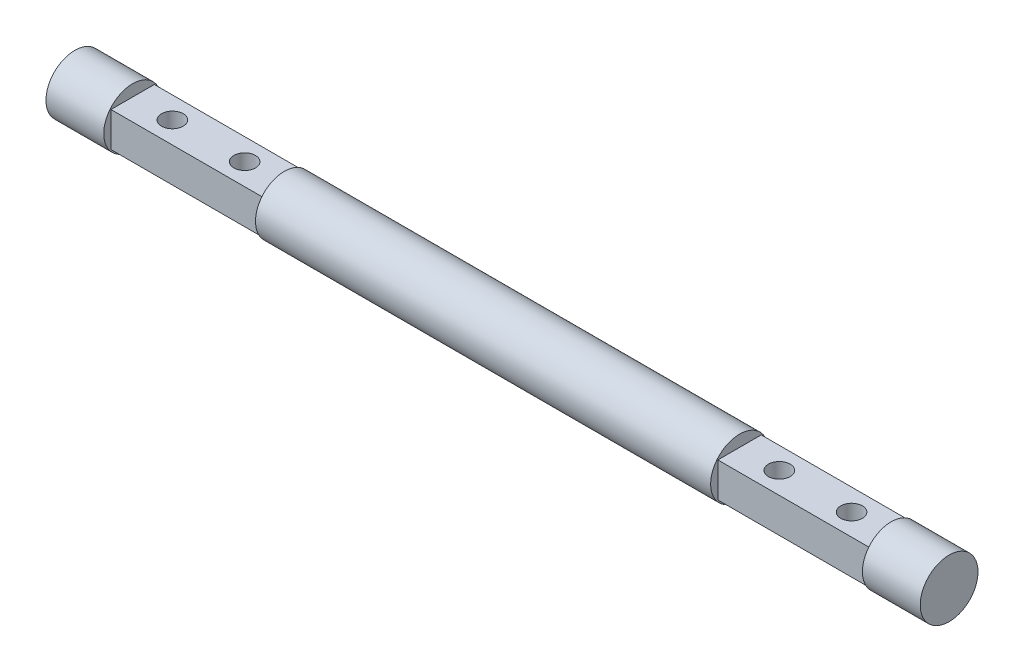
ISO-10303-21;
HEADER;
FILE_DESCRIPTION(('STEP AP214'),'2;1');
FILE_NAME('part.step','',(''),(''),'','','');
FILE_SCHEMA(('AUTOMOTIVE_DESIGN { 1 0 10303 214 1 1 1 1 }'));
ENDSEC;
DATA;
#1=APPLICATION_CONTEXT('core data for automotive mechanical design processes');
#2=APPLICATION_PROTOCOL_DEFINITION('international standard','automotive_design',2000,#1);
#3=PRODUCT_CONTEXT('',#1,'mechanical');
#4=PRODUCT('Part','Part','',(#3));
#5=PRODUCT_RELATED_PRODUCT_CATEGORY('part','',(#4));
#6=PRODUCT_DEFINITION_FORMATION('','',#4);
#7=PRODUCT_DEFINITION_CONTEXT('part definition',#1,'design');
#8=PRODUCT_DEFINITION('design','',#6,#7);
#9=PRODUCT_DEFINITION_SHAPE('','',#8);
#10=(LENGTH_UNIT() NAMED_UNIT(*) SI_UNIT(.MILLI.,.METRE.));
#11=(NAMED_UNIT(*) PLANE_ANGLE_UNIT() SI_UNIT($,.RADIAN.));
#12=(NAMED_UNIT(*) SI_UNIT($,.STERADIAN.) SOLID_ANGLE_UNIT());
#13=UNCERTAINTY_MEASURE_WITH_UNIT(LENGTH_MEASURE(1.E-05),#10,'distance_accuracy_value','');
#14=(GEOMETRIC_REPRESENTATION_CONTEXT(3) GLOBAL_UNCERTAINTY_ASSIGNED_CONTEXT((#13)) GLOBAL_UNIT_ASSIGNED_CONTEXT((#10,
#11,#12)) REPRESENTATION_CONTEXT('',''));
#15=CARTESIAN_POINT('',(0.,0.,0.));
#16=DIRECTION('',(0.,0.,1.));
#17=DIRECTION('',(1.,0.,0.));
#18=AXIS2_PLACEMENT_3D('',#15,#16,#17);
#19=CARTESIAN_POINT('',(-31.5,0.,0.));
#20=DIRECTION('',(-1.,0.,0.));
#21=DIRECTION('',(0.,0.,-1.));
#22=AXIS2_PLACEMENT_3D('',#19,#20,#21);
#23=PLANE('',#22);
#24=CARTESIAN_POINT('',(-31.5,0.,0.));
#25=DIRECTION('',(1.,0.,0.));
#26=DIRECTION('',(0.,0.,-1.));
#27=AXIS2_PLACEMENT_3D('',#24,#25,#26);
#28=CIRCLE('',#27,4.);
#29=CARTESIAN_POINT('',(-31.5,0.,-4.));
#30=VERTEX_POINT('',#29);
#31=EDGE_CURVE('E155',#30,#30,#28,.T.);
#32=ORIENTED_EDGE('',*,*,#31,.F.);
#33=EDGE_LOOP('',(#32));
#34=FACE_BOUND('',#33,.T.);
#35=DIRECTION('',(0.,0.,1.));
#36=VECTOR('',#35,1.);
#37=CARTESIAN_POINT('',(-31.5,2.4,-3.));
#38=LINE('',#37,#36);
#39=CARTESIAN_POINT('',(-31.5,2.4,-3.));
#40=VERTEX_POINT('',#39);
#41=CARTESIAN_POINT('',(-31.5,2.4,3.));
#42=VERTEX_POINT('',#41);
#43=EDGE_CURVE('E145',#40,#42,#38,.T.);
#44=ORIENTED_EDGE('',*,*,#43,.T.);
#45=DIRECTION('',(0.,-1.,0.));
#46=VECTOR('',#45,1.);
#47=CARTESIAN_POINT('',(-31.5,-2.4,3.));
#48=LINE('',#47,#46);
#49=CARTESIAN_POINT('',(-31.5,-2.4,3.));
#50=VERTEX_POINT('',#49);
#51=EDGE_CURVE('E63',#42,#50,#48,.T.);
#52=ORIENTED_EDGE('',*,*,#51,.T.);
#53=DIRECTION('',(0.,0.,-1.));
#54=VECTOR('',#53,1.);
#55=CARTESIAN_POINT('',(-31.5,-2.4,-3.));
#56=LINE('',#55,#54);
#57=CARTESIAN_POINT('',(-31.5,-2.4,-3.));
#58=VERTEX_POINT('',#57);
#59=EDGE_CURVE('E128',#50,#58,#56,.T.);
#60=ORIENTED_EDGE('',*,*,#59,.T.);
#61=DIRECTION('',(0.,1.,0.));
#62=VECTOR('',#61,1.);
#63=CARTESIAN_POINT('',(-31.5,-2.4,-3.));
#64=LINE('',#63,#62);
#65=EDGE_CURVE('E137',#58,#40,#64,.T.);
#66=ORIENTED_EDGE('',*,*,#65,.T.);
#67=EDGE_LOOP('',(#44,#52,#60,#66));
#68=FACE_BOUND('',#67,.T.);
#69=ADVANCED_FACE('F46',(#34,#68),#23,.T.);
#70=CARTESIAN_POINT('',(31.5,0.,0.));
#71=DIRECTION('',(-1.,0.,0.));
#72=DIRECTION('',(0.,0.,1.));
#73=AXIS2_PLACEMENT_3D('',#70,#71,#72);
#74=CYLINDRICAL_SURFACE('',#73,4.);
#75=CARTESIAN_POINT('',(31.5,0.,0.));
#76=DIRECTION('',(1.,0.,0.));
#77=DIRECTION('',(0.,0.,-1.));
#78=AXIS2_PLACEMENT_3D('',#75,#76,#77);
#79=CIRCLE('',#78,4.);
#80=CARTESIAN_POINT('',(31.5,0.,-4.));
#81=VERTEX_POINT('',#80);
#82=EDGE_CURVE('E11',#81,#81,#79,.T.);
#83=ORIENTED_EDGE('',*,*,#82,.F.);
#84=EDGE_LOOP('',(#83));
#85=FACE_BOUND('',#84,.T.);
#86=ORIENTED_EDGE('',*,*,#31,.T.);
#87=EDGE_LOOP('',(#86));
#88=FACE_BOUND('',#87,.T.);
#89=ADVANCED_FACE('F48',(#85,#88),#74,.T.);
#90=CARTESIAN_POINT('',(31.5,0.,0.));
#91=DIRECTION('',(1.,0.,0.));
#92=DIRECTION('',(0.,0.,-1.));
#93=AXIS2_PLACEMENT_3D('',#90,#91,#92);
#94=PLANE('',#93);
#95=DIRECTION('',(0.,-1.,0.));
#96=VECTOR('',#95,1.);
#97=CARTESIAN_POINT('',(31.5,-2.4,3.));
#98=LINE('',#97,#96);
#99=CARTESIAN_POINT('',(31.5,2.4,3.));
#100=VERTEX_POINT('',#99);
#101=CARTESIAN_POINT('',(31.5,-2.4,3.));
#102=VERTEX_POINT('',#101);
#103=EDGE_CURVE('E71',#100,#102,#98,.T.);
#104=ORIENTED_EDGE('',*,*,#103,.F.);
#105=DIRECTION('',(0.,0.,1.));
#106=VECTOR('',#105,1.);
#107=CARTESIAN_POINT('',(31.5,2.4,-3.));
#108=LINE('',#107,#106);
#109=CARTESIAN_POINT('',(31.5,2.4,-3.));
#110=VERTEX_POINT('',#109);
#111=EDGE_CURVE('E168',#110,#100,#108,.T.);
#112=ORIENTED_EDGE('',*,*,#111,.F.);
#113=DIRECTION('',(0.,1.,0.));
#114=VECTOR('',#113,1.);
#115=CARTESIAN_POINT('',(31.5,-2.4,-3.));
#116=LINE('',#115,#114);
#117=CARTESIAN_POINT('',(31.5,-2.4,-3.));
#118=VERTEX_POINT('',#117);
#119=EDGE_CURVE('E182',#118,#110,#116,.T.);
#120=ORIENTED_EDGE('',*,*,#119,.F.);
#121=DIRECTION('',(0.,0.,-1.));
#122=VECTOR('',#121,1.);
#123=CARTESIAN_POINT('',(31.5,-2.4,-3.));
#124=LINE('',#123,#122);
#125=EDGE_CURVE('E179',#102,#118,#124,.T.);
#126=ORIENTED_EDGE('',*,*,#125,.F.);
#127=EDGE_LOOP('',(#104,#112,#120,#126));
#128=FACE_BOUND('',#127,.T.);
#129=ORIENTED_EDGE('',*,*,#82,.T.);
#130=EDGE_LOOP('',(#129));
#131=FACE_BOUND('',#130,.T.);
#132=ADVANCED_FACE('F248',(#128,#131),#94,.T.);
#133=CARTESIAN_POINT('',(52.5,-2.4,3.));
#134=DIRECTION('',(0.,0.,-1.));
#135=DIRECTION('',(0.,1.,0.));
#136=AXIS2_PLACEMENT_3D('',#133,#134,#135);
#137=PLANE('',#136);
#138=ORIENTED_EDGE('',*,*,#103,.T.);
#139=DIRECTION('',(-1.,0.,0.));
#140=VECTOR('',#139,1.);
#141=CARTESIAN_POINT('',(52.5,-2.4,3.));
#142=LINE('',#141,#140);
#143=CARTESIAN_POINT('',(52.5,-2.4,3.));
#144=VERTEX_POINT('',#143);
#145=EDGE_CURVE('E55',#144,#102,#142,.T.);
#146=ORIENTED_EDGE('',*,*,#145,.F.);
#147=DIRECTION('',(0.,-1.,0.));
#148=VECTOR('',#147,1.);
#149=CARTESIAN_POINT('',(52.5,-2.4,3.));
#150=LINE('',#149,#148);
#151=CARTESIAN_POINT('',(52.5,2.4,3.));
#152=VERTEX_POINT('',#151);
#153=EDGE_CURVE('E164',#152,#144,#150,.T.);
#154=ORIENTED_EDGE('',*,*,#153,.F.);
#155=DIRECTION('',(-1.,0.,0.));
#156=VECTOR('',#155,1.);
#157=CARTESIAN_POINT('',(52.5,2.4,3.));
#158=LINE('',#157,#156);
#159=EDGE_CURVE('E177',#152,#100,#158,.T.);
#160=ORIENTED_EDGE('',*,*,#159,.T.);
#161=EDGE_LOOP('',(#138,#146,#154,#160));
#162=FACE_BOUND('',#161,.T.);
#163=ADVANCED_FACE('F277',(#162),#137,.F.);
#164=CARTESIAN_POINT('',(52.5,-2.4,-3.));
#165=DIRECTION('',(0.,1.,0.));
#166=DIRECTION('',(0.,0.,1.));
#167=AXIS2_PLACEMENT_3D('',#164,#165,#166);
#168=PLANE('',#167);
#169=CARTESIAN_POINT('',(37.,-2.4,0.));
#170=DIRECTION('',(0.,1.,0.));
#171=DIRECTION('',(0.,0.,1.));
#172=AXIS2_PLACEMENT_3D('',#169,#170,#171);
#173=CIRCLE('',#172,1.5);
#174=CARTESIAN_POINT('',(37.,-2.4,1.50000000000001));
#175=VERTEX_POINT('',#174);
#176=EDGE_CURVE('E218',#175,#175,#173,.T.);
#177=ORIENTED_EDGE('',*,*,#176,.T.);
#178=EDGE_LOOP('',(#177));
#179=FACE_BOUND('',#178,.T.);
#180=CARTESIAN_POINT('',(47.,-2.4,0.));
#181=DIRECTION('',(0.,1.,0.));
#182=DIRECTION('',(0.,0.,1.));
#183=AXIS2_PLACEMENT_3D('',#180,#181,#182);
#184=CIRCLE('',#183,1.5);
#185=CARTESIAN_POINT('',(47.,-2.4,1.5));
#186=VERTEX_POINT('',#185);
#187=EDGE_CURVE('E201',#186,#186,#184,.T.);
#188=ORIENTED_EDGE('',*,*,#187,.T.);
#189=EDGE_LOOP('',(#188));
#190=FACE_BOUND('',#189,.T.);
#191=ORIENTED_EDGE('',*,*,#125,.T.);
#192=DIRECTION('',(-1.,0.,0.));
#193=VECTOR('',#192,1.);
#194=CARTESIAN_POINT('',(52.5,-2.4,-3.));
#195=LINE('',#194,#193);
#196=CARTESIAN_POINT('',(52.5,-2.4,-3.));
#197=VERTEX_POINT('',#196);
#198=EDGE_CURVE('E191',#197,#118,#195,.T.);
#199=ORIENTED_EDGE('',*,*,#198,.F.);
#200=DIRECTION('',(0.,0.,-1.));
#201=VECTOR('',#200,1.);
#202=CARTESIAN_POINT('',(52.5,-2.4,-3.));
#203=LINE('',#202,#201);
#204=EDGE_CURVE('E167',#144,#197,#203,.T.);
#205=ORIENTED_EDGE('',*,*,#204,.F.);
#206=ORIENTED_EDGE('',*,*,#145,.T.);
#207=EDGE_LOOP('',(#191,#199,#205,#206));
#208=FACE_BOUND('',#207,.T.);
#209=ADVANCED_FACE('F273',(#179,#190,#208),#168,.F.);
#210=CARTESIAN_POINT('',(52.5,-2.4,-3.));
#211=DIRECTION('',(0.,0.,1.));
#212=DIRECTION('',(1.,0.,0.));
#213=AXIS2_PLACEMENT_3D('',#210,#211,#212);
#214=PLANE('',#213);
#215=ORIENTED_EDGE('',*,*,#119,.T.);
#216=DIRECTION('',(-1.,0.,0.));
#217=VECTOR('',#216,1.);
#218=CARTESIAN_POINT('',(52.5,2.4,-3.));
#219=LINE('',#218,#217);
#220=CARTESIAN_POINT('',(52.5,2.4,-3.));
#221=VERTEX_POINT('',#220);
#222=EDGE_CURVE('E188',#221,#110,#219,.T.);
#223=ORIENTED_EDGE('',*,*,#222,.F.);
#224=DIRECTION('',(0.,1.,0.));
#225=VECTOR('',#224,1.);
#226=CARTESIAN_POINT('',(52.5,-2.4,-3.));
#227=LINE('',#226,#225);
#228=EDGE_CURVE('E171',#197,#221,#227,.T.);
#229=ORIENTED_EDGE('',*,*,#228,.F.);
#230=ORIENTED_EDGE('',*,*,#198,.T.);
#231=EDGE_LOOP('',(#215,#223,#229,#230));
#232=FACE_BOUND('',#231,.T.);
#233=ADVANCED_FACE('F269',(#232),#214,.F.);
#234=CARTESIAN_POINT('',(52.5,2.4,-3.));
#235=DIRECTION('',(0.,-1.,0.));
#236=DIRECTION('',(0.,0.,-1.));
#237=AXIS2_PLACEMENT_3D('',#234,#235,#236);
#238=PLANE('',#237);
#239=CARTESIAN_POINT('',(37.,2.4,0.));
#240=DIRECTION('',(0.,1.,0.));
#241=DIRECTION('',(0.,0.,-1.));
#242=AXIS2_PLACEMENT_3D('',#239,#240,#241);
#243=CIRCLE('',#242,1.5);
#244=CARTESIAN_POINT('',(37.,2.4,-1.5));
#245=VERTEX_POINT('',#244);
#246=EDGE_CURVE('E211',#245,#245,#243,.T.);
#247=ORIENTED_EDGE('',*,*,#246,.F.);
#248=EDGE_LOOP('',(#247));
#249=FACE_BOUND('',#248,.T.);
#250=CARTESIAN_POINT('',(47.,2.4,0.));
#251=DIRECTION('',(0.,1.,0.));
#252=DIRECTION('',(0.,0.,-1.));
#253=AXIS2_PLACEMENT_3D('',#250,#251,#252);
#254=CIRCLE('',#253,1.5);
#255=CARTESIAN_POINT('',(47.,2.4,-1.50000000000001));
#256=VERTEX_POINT('',#255);
#257=EDGE_CURVE('E208',#256,#256,#254,.T.);
#258=ORIENTED_EDGE('',*,*,#257,.F.);
#259=EDGE_LOOP('',(#258));
#260=FACE_BOUND('',#259,.T.);
#261=ORIENTED_EDGE('',*,*,#111,.T.);
#262=ORIENTED_EDGE('',*,*,#159,.F.);
#263=DIRECTION('',(0.,0.,1.));
#264=VECTOR('',#263,1.);
#265=CARTESIAN_POINT('',(52.5,2.4,-3.));
#266=LINE('',#265,#264);
#267=EDGE_CURVE('E174',#221,#152,#266,.T.);
#268=ORIENTED_EDGE('',*,*,#267,.F.);
#269=ORIENTED_EDGE('',*,*,#222,.T.);
#270=EDGE_LOOP('',(#261,#262,#268,#269));
#271=FACE_BOUND('',#270,.T.);
#272=ADVANCED_FACE('F262',(#249,#260,#271),#238,.F.);
#273=CARTESIAN_POINT('',(52.5,0.,0.));
#274=DIRECTION('',(1.,0.,0.));
#275=DIRECTION('',(0.,0.,-1.));
#276=AXIS2_PLACEMENT_3D('',#273,#274,#275);
#277=PLANE('',#276);
#278=CARTESIAN_POINT('',(52.5,0.,0.));
#279=DIRECTION('',(1.,0.,0.));
#280=DIRECTION('',(0.,0.,-1.));
#281=AXIS2_PLACEMENT_3D('',#278,#279,#280);
#282=CIRCLE('',#281,4.);
#283=CARTESIAN_POINT('',(52.5,0.,-4.));
#284=VERTEX_POINT('',#283);
#285=EDGE_CURVE('E158',#284,#284,#282,.T.);
#286=ORIENTED_EDGE('',*,*,#285,.F.);
#287=EDGE_LOOP('',(#286));
#288=FACE_BOUND('',#287,.T.);
#289=ORIENTED_EDGE('',*,*,#267,.T.);
#290=ORIENTED_EDGE('',*,*,#153,.T.);
#291=ORIENTED_EDGE('',*,*,#204,.T.);
#292=ORIENTED_EDGE('',*,*,#228,.T.);
#293=EDGE_LOOP('',(#289,#290,#291,#292));
#294=FACE_BOUND('',#293,.T.);
#295=ADVANCED_FACE('F259',(#288,#294),#277,.F.);
#296=CARTESIAN_POINT('',(60.5,0.,0.));
#297=DIRECTION('',(-1.,0.,0.));
#298=DIRECTION('',(0.,0.,1.));
#299=AXIS2_PLACEMENT_3D('',#296,#297,#298);
#300=CYLINDRICAL_SURFACE('',#299,4.);
#301=CARTESIAN_POINT('',(60.5,0.,0.));
#302=DIRECTION('',(1.,0.,0.));
#303=DIRECTION('',(0.,0.,-1.));
#304=AXIS2_PLACEMENT_3D('',#301,#302,#303);
#305=CIRCLE('',#304,4.);
#306=CARTESIAN_POINT('',(60.5,0.,-4.));
#307=VERTEX_POINT('',#306);
#308=EDGE_CURVE('E159',#307,#307,#305,.T.);
#309=ORIENTED_EDGE('',*,*,#308,.F.);
#310=EDGE_LOOP('',(#309));
#311=FACE_BOUND('',#310,.T.);
#312=ORIENTED_EDGE('',*,*,#285,.T.);
#313=EDGE_LOOP('',(#312));
#314=FACE_BOUND('',#313,.T.);
#315=ADVANCED_FACE('F257',(#311,#314),#300,.T.);
#316=CARTESIAN_POINT('',(60.5,0.,0.));
#317=DIRECTION('',(1.,0.,0.));
#318=DIRECTION('',(0.,0.,-1.));
#319=AXIS2_PLACEMENT_3D('',#316,#317,#318);
#320=PLANE('',#319);
#321=ORIENTED_EDGE('',*,*,#308,.T.);
#322=EDGE_LOOP('',(#321));
#323=FACE_BOUND('',#322,.T.);
#324=ADVANCED_FACE('F255',(#323),#320,.T.);
#325=CARTESIAN_POINT('',(-52.5,-2.4,3.));
#326=DIRECTION('',(0.,0.,1.));
#327=DIRECTION('',(0.,-1.,0.));
#328=AXIS2_PLACEMENT_3D('',#325,#326,#327);
#329=PLANE('',#328);
#330=ORIENTED_EDGE('',*,*,#51,.F.);
#331=DIRECTION('',(1.,0.,0.));
#332=VECTOR('',#331,1.);
#333=CARTESIAN_POINT('',(-52.5,2.4,3.));
#334=LINE('',#333,#332);
#335=CARTESIAN_POINT('',(-52.5,2.4,3.));
#336=VERTEX_POINT('',#335);
#337=EDGE_CURVE('E132',#336,#42,#334,.T.);
#338=ORIENTED_EDGE('',*,*,#337,.F.);
#339=DIRECTION('',(0.,-1.,0.));
#340=VECTOR('',#339,1.);
#341=CARTESIAN_POINT('',(-52.5,-2.4,3.));
#342=LINE('',#341,#340);
#343=CARTESIAN_POINT('',(-52.5,-2.4,3.));
#344=VERTEX_POINT('',#343);
#345=EDGE_CURVE('E118',#336,#344,#342,.T.);
#346=ORIENTED_EDGE('',*,*,#345,.T.);
#347=DIRECTION('',(1.,0.,0.));
#348=VECTOR('',#347,1.);
#349=CARTESIAN_POINT('',(-52.5,-2.4,3.));
#350=LINE('',#349,#348);
#351=EDGE_CURVE('E123',#344,#50,#350,.T.);
#352=ORIENTED_EDGE('',*,*,#351,.T.);
#353=EDGE_LOOP('',(#330,#338,#346,#352));
#354=FACE_BOUND('',#353,.T.);
#355=ADVANCED_FACE('F131',(#354),#329,.T.);
#356=CARTESIAN_POINT('',(-52.5,2.4,-3.));
#357=DIRECTION('',(0.,1.,0.));
#358=DIRECTION('',(0.,0.,1.));
#359=AXIS2_PLACEMENT_3D('',#356,#357,#358);
#360=PLANE('',#359);
#361=CARTESIAN_POINT('',(-47.,2.4,0.));
#362=DIRECTION('',(0.,1.,0.));
#363=DIRECTION('',(0.,0.,1.));
#364=AXIS2_PLACEMENT_3D('',#361,#362,#363);
#365=CIRCLE('',#364,1.5);
#366=CARTESIAN_POINT('',(-47.,2.4,1.5));
#367=VERTEX_POINT('',#366);
#368=EDGE_CURVE('E197',#367,#367,#365,.T.);
#369=ORIENTED_EDGE('',*,*,#368,.F.);
#370=EDGE_LOOP('',(#369));
#371=FACE_BOUND('',#370,.T.);
#372=CARTESIAN_POINT('',(-37.,2.4,0.));
#373=DIRECTION('',(0.,1.,0.));
#374=DIRECTION('',(0.,0.,1.));
#375=AXIS2_PLACEMENT_3D('',#372,#373,#374);
#376=CIRCLE('',#375,1.5);
#377=CARTESIAN_POINT('',(-37.,2.4,1.50000000000001));
#378=VERTEX_POINT('',#377);
#379=EDGE_CURVE('E203',#378,#378,#376,.T.);
#380=ORIENTED_EDGE('',*,*,#379,.F.);
#381=EDGE_LOOP('',(#380));
#382=FACE_BOUND('',#381,.T.);
#383=ORIENTED_EDGE('',*,*,#43,.F.);
#384=DIRECTION('',(1.,0.,0.));
#385=VECTOR('',#384,1.);
#386=CARTESIAN_POINT('',(-52.5,2.4,-3.));
#387=LINE('',#386,#385);
#388=CARTESIAN_POINT('',(-52.5,2.4,-3.));
#389=VERTEX_POINT('',#388);
#390=EDGE_CURVE('E152',#389,#40,#387,.T.);
#391=ORIENTED_EDGE('',*,*,#390,.F.);
#392=DIRECTION('',(0.,0.,1.));
#393=VECTOR('',#392,1.);
#394=CARTESIAN_POINT('',(-52.5,2.4,-3.));
#395=LINE('',#394,#393);
#396=EDGE_CURVE('E134',#389,#336,#395,.T.);
#397=ORIENTED_EDGE('',*,*,#396,.T.);
#398=ORIENTED_EDGE('',*,*,#337,.T.);
#399=EDGE_LOOP('',(#383,#391,#397,#398));
#400=FACE_BOUND('',#399,.T.);
#401=ADVANCED_FACE('F336',(#371,#382,#400),#360,.T.);
#402=CARTESIAN_POINT('',(-52.5,-2.4,-3.));
#403=DIRECTION('',(0.,0.,-1.));
#404=DIRECTION('',(-1.,0.,0.));
#405=AXIS2_PLACEMENT_3D('',#402,#403,#404);
#406=PLANE('',#405);
#407=ORIENTED_EDGE('',*,*,#65,.F.);
#408=DIRECTION('',(1.,0.,0.));
#409=VECTOR('',#408,1.);
#410=CARTESIAN_POINT('',(-52.5,-2.4,-3.));
#411=LINE('',#410,#409);
#412=CARTESIAN_POINT('',(-52.5,-2.4,-3.));
#413=VERTEX_POINT('',#412);
#414=EDGE_CURVE('E129',#413,#58,#411,.T.);
#415=ORIENTED_EDGE('',*,*,#414,.F.);
#416=DIRECTION('',(0.,1.,0.));
#417=VECTOR('',#416,1.);
#418=CARTESIAN_POINT('',(-52.5,-2.4,-3.));
#419=LINE('',#418,#417);
#420=EDGE_CURVE('E120',#413,#389,#419,.T.);
#421=ORIENTED_EDGE('',*,*,#420,.T.);
#422=ORIENTED_EDGE('',*,*,#390,.T.);
#423=EDGE_LOOP('',(#407,#415,#421,#422));
#424=FACE_BOUND('',#423,.T.);
#425=ADVANCED_FACE('F237',(#424),#406,.T.);
#426=CARTESIAN_POINT('',(-52.5,-2.4,-3.));
#427=DIRECTION('',(0.,-1.,0.));
#428=DIRECTION('',(0.,0.,-1.));
#429=AXIS2_PLACEMENT_3D('',#426,#427,#428);
#430=PLANE('',#429);
#431=CARTESIAN_POINT('',(-47.,-2.4,0.));
#432=DIRECTION('',(0.,-1.,0.));
#433=DIRECTION('',(0.,0.,-1.));
#434=AXIS2_PLACEMENT_3D('',#431,#432,#433);
#435=CIRCLE('',#434,1.5);
#436=CARTESIAN_POINT('',(-47.,-2.4,-1.50000000000001));
#437=VERTEX_POINT('',#436);
#438=EDGE_CURVE('E50',#437,#437,#435,.T.);
#439=ORIENTED_EDGE('',*,*,#438,.F.);
#440=EDGE_LOOP('',(#439));
#441=FACE_BOUND('',#440,.T.);
#442=CARTESIAN_POINT('',(-37.,-2.4,0.));
#443=DIRECTION('',(0.,-1.,0.));
#444=DIRECTION('',(0.,0.,-1.));
#445=AXIS2_PLACEMENT_3D('',#442,#443,#444);
#446=CIRCLE('',#445,1.5);
#447=CARTESIAN_POINT('',(-37.,-2.4,-1.5));
#448=VERTEX_POINT('',#447);
#449=EDGE_CURVE('E195',#448,#448,#446,.T.);
#450=ORIENTED_EDGE('',*,*,#449,.F.);
#451=EDGE_LOOP('',(#450));
#452=FACE_BOUND('',#451,.T.);
#453=ORIENTED_EDGE('',*,*,#59,.F.);
#454=ORIENTED_EDGE('',*,*,#351,.F.);
#455=DIRECTION('',(0.,0.,-1.));
#456=VECTOR('',#455,1.);
#457=CARTESIAN_POINT('',(-52.5,-2.4,-3.));
#458=LINE('',#457,#456);
#459=EDGE_CURVE('E113',#344,#413,#458,.T.);
#460=ORIENTED_EDGE('',*,*,#459,.T.);
#461=ORIENTED_EDGE('',*,*,#414,.T.);
#462=EDGE_LOOP('',(#453,#454,#460,#461));
#463=FACE_BOUND('',#462,.T.);
#464=ADVANCED_FACE('F126',(#441,#452,#463),#430,.T.);
#465=CARTESIAN_POINT('',(-60.5,0.,0.));
#466=DIRECTION('',(1.,0.,0.));
#467=DIRECTION('',(0.,0.,-1.));
#468=AXIS2_PLACEMENT_3D('',#465,#466,#467);
#469=CYLINDRICAL_SURFACE('',#468,4.);
#470=CARTESIAN_POINT('',(-60.5,0.,0.));
#471=DIRECTION('',(1.,0.,0.));
#472=DIRECTION('',(0.,0.,-1.));
#473=AXIS2_PLACEMENT_3D('',#470,#471,#472);
#474=CIRCLE('',#473,4.);
#475=CARTESIAN_POINT('',(-60.5,0.,-4.));
#476=VERTEX_POINT('',#475);
#477=EDGE_CURVE('E146',#476,#476,#474,.T.);
#478=ORIENTED_EDGE('',*,*,#477,.T.);
#479=EDGE_LOOP('',(#478));
#480=FACE_BOUND('',#479,.T.);
#481=CARTESIAN_POINT('',(-52.5,0.,0.));
#482=DIRECTION('',(1.,0.,0.));
#483=DIRECTION('',(0.,0.,-1.));
#484=AXIS2_PLACEMENT_3D('',#481,#482,#483);
#485=CIRCLE('',#484,4.);
#486=CARTESIAN_POINT('',(-52.5,0.,-4.));
#487=VERTEX_POINT('',#486);
#488=EDGE_CURVE('E140',#487,#487,#485,.T.);
#489=ORIENTED_EDGE('',*,*,#488,.F.);
#490=EDGE_LOOP('',(#489));
#491=FACE_BOUND('',#490,.T.);
#492=ADVANCED_FACE('F226',(#480,#491),#469,.T.);
#493=CARTESIAN_POINT('',(-60.5,0.,0.));
#494=DIRECTION('',(-1.,0.,0.));
#495=DIRECTION('',(0.,0.,-1.));
#496=AXIS2_PLACEMENT_3D('',#493,#494,#495);
#497=PLANE('',#496);
#498=ORIENTED_EDGE('',*,*,#477,.F.);
#499=EDGE_LOOP('',(#498));
#500=FACE_BOUND('',#499,.T.);
#501=ADVANCED_FACE('F228',(#500),#497,.T.);
#502=CARTESIAN_POINT('',(-52.5,0.,0.));
#503=DIRECTION('',(-1.,0.,0.));
#504=DIRECTION('',(0.,0.,-1.));
#505=AXIS2_PLACEMENT_3D('',#502,#503,#504);
#506=PLANE('',#505);
#507=ORIENTED_EDGE('',*,*,#345,.F.);
#508=ORIENTED_EDGE('',*,*,#396,.F.);
#509=ORIENTED_EDGE('',*,*,#420,.F.);
#510=ORIENTED_EDGE('',*,*,#459,.F.);
#511=EDGE_LOOP('',(#507,#508,#509,#510));
#512=FACE_BOUND('',#511,.T.);
#513=ORIENTED_EDGE('',*,*,#488,.T.);
#514=EDGE_LOOP('',(#513));
#515=FACE_BOUND('',#514,.T.);
#516=ADVANCED_FACE('F115',(#512,#515),#506,.F.);
#517=CARTESIAN_POINT('',(-37.,-4.,0.));
#518=DIRECTION('',(0.,1.,0.));
#519=DIRECTION('',(0.,0.,1.));
#520=AXIS2_PLACEMENT_3D('',#517,#518,#519);
#521=CYLINDRICAL_SURFACE('',#520,1.5);
#522=ORIENTED_EDGE('',*,*,#449,.T.);
#523=EDGE_LOOP('',(#522));
#524=FACE_BOUND('',#523,.T.);
#525=ORIENTED_EDGE('',*,*,#379,.T.);
#526=EDGE_LOOP('',(#525));
#527=FACE_BOUND('',#526,.T.);
#528=ADVANCED_FACE('F377',(#524,#527),#521,.F.);
#529=CARTESIAN_POINT('',(-47.,-4.,0.));
#530=DIRECTION('',(0.,1.,0.));
#531=DIRECTION('',(0.,0.,1.));
#532=AXIS2_PLACEMENT_3D('',#529,#530,#531);
#533=CYLINDRICAL_SURFACE('',#532,1.5);
#534=ORIENTED_EDGE('',*,*,#438,.T.);
#535=EDGE_LOOP('',(#534));
#536=FACE_BOUND('',#535,.T.);
#537=ORIENTED_EDGE('',*,*,#368,.T.);
#538=EDGE_LOOP('',(#537));
#539=FACE_BOUND('',#538,.T.);
#540=ADVANCED_FACE('F384',(#536,#539),#533,.F.);
#541=CARTESIAN_POINT('',(47.,-4.,0.));
#542=DIRECTION('',(0.,1.,0.));
#543=DIRECTION('',(0.,0.,1.));
#544=AXIS2_PLACEMENT_3D('',#541,#542,#543);
#545=CYLINDRICAL_SURFACE('',#544,1.5);
#546=ORIENTED_EDGE('',*,*,#257,.T.);
#547=EDGE_LOOP('',(#546));
#548=FACE_BOUND('',#547,.T.);
#549=ORIENTED_EDGE('',*,*,#187,.F.);
#550=EDGE_LOOP('',(#549));
#551=FACE_BOUND('',#550,.T.);
#552=ADVANCED_FACE('F393',(#548,#551),#545,.F.);
#553=CARTESIAN_POINT('',(37.,-4.,0.));
#554=DIRECTION('',(0.,1.,0.));
#555=DIRECTION('',(0.,0.,1.));
#556=AXIS2_PLACEMENT_3D('',#553,#554,#555);
#557=CYLINDRICAL_SURFACE('',#556,1.5);
#558=ORIENTED_EDGE('',*,*,#246,.T.);
#559=EDGE_LOOP('',(#558));
#560=FACE_BOUND('',#559,.T.);
#561=ORIENTED_EDGE('',*,*,#176,.F.);
#562=EDGE_LOOP('',(#561));
#563=FACE_BOUND('',#562,.T.);
#564=ADVANCED_FACE('F403',(#560,#563),#557,.F.);
#565=CLOSED_SHELL('',(#69,#89,#132,#163,#209,#233,#272,#295,#315,#324,#355,#401,#425,#464,#492,
#501,#516,#528,#540,#552,#564));
#566=MANIFOLD_SOLID_BREP('B2',#565);
#567=ADVANCED_BREP_SHAPE_REPRESENTATION('',(#18,#566),#14);
#568=SHAPE_DEFINITION_REPRESENTATION(#9,#567);
ENDSEC;
END-ISO-10303-21;
